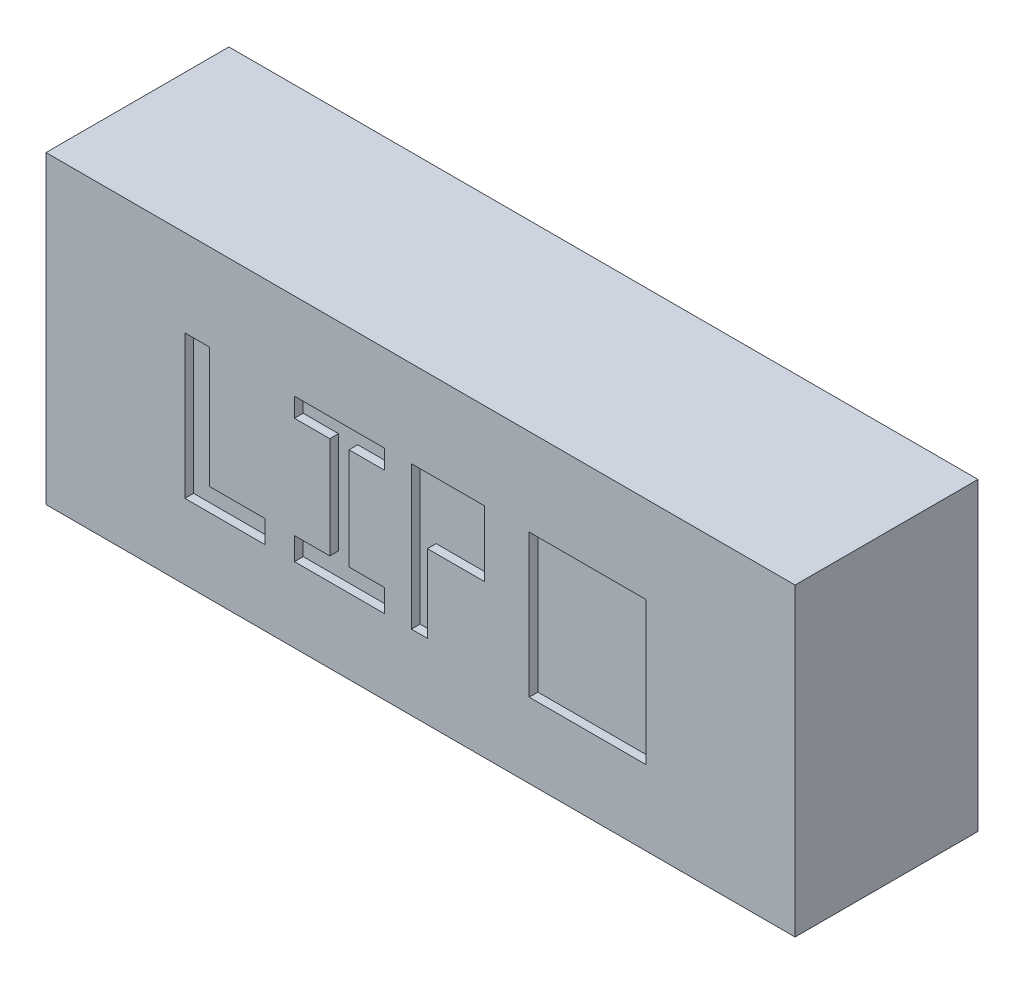
ISO-10303-21;
HEADER;
FILE_DESCRIPTION(('STEP AP214'),'2;1');
FILE_NAME('part.step','',(''),(''),'','','');
FILE_SCHEMA(('AUTOMOTIVE_DESIGN { 1 0 10303 214 1 1 1 1 }'));
ENDSEC;
DATA;
#1=APPLICATION_CONTEXT('core data for automotive mechanical design processes');
#2=APPLICATION_PROTOCOL_DEFINITION('international standard','automotive_design',2000,#1);
#3=PRODUCT_CONTEXT('',#1,'mechanical');
#4=PRODUCT('Part','Part','',(#3));
#5=PRODUCT_RELATED_PRODUCT_CATEGORY('part','',(#4));
#6=PRODUCT_DEFINITION_FORMATION('','',#4);
#7=PRODUCT_DEFINITION_CONTEXT('part definition',#1,'design');
#8=PRODUCT_DEFINITION('design','',#6,#7);
#9=PRODUCT_DEFINITION_SHAPE('','',#8);
#10=(LENGTH_UNIT() NAMED_UNIT(*) SI_UNIT(.MILLI.,.METRE.));
#11=(NAMED_UNIT(*) PLANE_ANGLE_UNIT() SI_UNIT($,.RADIAN.));
#12=(NAMED_UNIT(*) SI_UNIT($,.STERADIAN.) SOLID_ANGLE_UNIT());
#13=UNCERTAINTY_MEASURE_WITH_UNIT(LENGTH_MEASURE(1.E-05),#10,'distance_accuracy_value','');
#14=(GEOMETRIC_REPRESENTATION_CONTEXT(3) GLOBAL_UNCERTAINTY_ASSIGNED_CONTEXT((#13)) GLOBAL_UNIT_ASSIGNED_CONTEXT((#10,
#11,#12)) REPRESENTATION_CONTEXT('',''));
#15=CARTESIAN_POINT('',(0.,0.,0.));
#16=DIRECTION('',(0.,0.,1.));
#17=DIRECTION('',(1.,0.,0.));
#18=AXIS2_PLACEMENT_3D('',#15,#16,#17);
#19=CARTESIAN_POINT('',(43.,35.,10.5));
#20=DIRECTION('',(-1.,0.,0.));
#21=DIRECTION('',(0.,0.,1.));
#22=AXIS2_PLACEMENT_3D('',#19,#20,#21);
#23=PLANE('',#22);
#24=DIRECTION('',(0.,0.,-1.));
#25=VECTOR('',#24,1.);
#26=CARTESIAN_POINT('',(43.,0.,10.5));
#27=LINE('',#26,#25);
#28=CARTESIAN_POINT('',(43.,0.,10.5));
#29=VERTEX_POINT('',#28);
#30=CARTESIAN_POINT('',(43.,0.,-10.5));
#31=VERTEX_POINT('',#30);
#32=EDGE_CURVE('E313',#29,#31,#27,.T.);
#33=ORIENTED_EDGE('',*,*,#32,.T.);
#34=DIRECTION('',(0.,-1.,0.));
#35=VECTOR('',#34,1.);
#36=CARTESIAN_POINT('',(43.,35.,-10.5));
#37=LINE('',#36,#35);
#38=CARTESIAN_POINT('',(43.,35.,-10.5));
#39=VERTEX_POINT('',#38);
#40=EDGE_CURVE('E11',#39,#31,#37,.T.);
#41=ORIENTED_EDGE('',*,*,#40,.F.);
#42=DIRECTION('',(0.,0.,-1.));
#43=VECTOR('',#42,1.);
#44=CARTESIAN_POINT('',(43.,35.,10.5));
#45=LINE('',#44,#43);
#46=CARTESIAN_POINT('',(43.,35.,10.5));
#47=VERTEX_POINT('',#46);
#48=EDGE_CURVE('E565',#47,#39,#45,.T.);
#49=ORIENTED_EDGE('',*,*,#48,.F.);
#50=DIRECTION('',(0.,-1.,0.));
#51=VECTOR('',#50,1.);
#52=CARTESIAN_POINT('',(43.,35.,10.5));
#53=LINE('',#52,#51);
#54=EDGE_CURVE('E579',#47,#29,#53,.T.);
#55=ORIENTED_EDGE('',*,*,#54,.T.);
#56=EDGE_LOOP('',(#33,#41,#49,#55));
#57=FACE_BOUND('',#56,.T.);
#58=ADVANCED_FACE('F43',(#57),#23,.F.);
#59=CARTESIAN_POINT('',(-43.,35.,-10.5));
#60=DIRECTION('',(0.,0.,1.));
#61=DIRECTION('',(1.,0.,0.));
#62=AXIS2_PLACEMENT_3D('',#59,#60,#61);
#63=PLANE('',#62);
#64=DIRECTION('',(-1.,0.,0.));
#65=VECTOR('',#64,1.);
#66=CARTESIAN_POINT('',(-43.,0.,-10.5));
#67=LINE('',#66,#65);
#68=CARTESIAN_POINT('',(-43.,0.,-10.5));
#69=VERTEX_POINT('',#68);
#70=EDGE_CURVE('E583',#31,#69,#67,.T.);
#71=ORIENTED_EDGE('',*,*,#70,.T.);
#72=DIRECTION('',(0.,-1.,0.));
#73=VECTOR('',#72,1.);
#74=CARTESIAN_POINT('',(-43.,35.,-10.5));
#75=LINE('',#74,#73);
#76=CARTESIAN_POINT('',(-43.,35.,-10.5));
#77=VERTEX_POINT('',#76);
#78=EDGE_CURVE('E51',#77,#69,#75,.T.);
#79=ORIENTED_EDGE('',*,*,#78,.F.);
#80=DIRECTION('',(-1.,0.,0.));
#81=VECTOR('',#80,1.);
#82=CARTESIAN_POINT('',(-43.,35.,-10.5));
#83=LINE('',#82,#81);
#84=EDGE_CURVE('E569',#39,#77,#83,.T.);
#85=ORIENTED_EDGE('',*,*,#84,.F.);
#86=ORIENTED_EDGE('',*,*,#40,.T.);
#87=EDGE_LOOP('',(#71,#79,#85,#86));
#88=FACE_BOUND('',#87,.T.);
#89=ADVANCED_FACE('F619',(#88),#63,.F.);
#90=CARTESIAN_POINT('',(-43.,35.,10.5));
#91=DIRECTION('',(1.,0.,0.));
#92=DIRECTION('',(0.,0.,-1.));
#93=AXIS2_PLACEMENT_3D('',#90,#91,#92);
#94=PLANE('',#93);
#95=DIRECTION('',(0.,0.,1.));
#96=VECTOR('',#95,1.);
#97=CARTESIAN_POINT('',(-43.,0.,10.5));
#98=LINE('',#97,#96);
#99=CARTESIAN_POINT('',(-43.,0.,10.5));
#100=VERTEX_POINT('',#99);
#101=EDGE_CURVE('E586',#69,#100,#98,.T.);
#102=ORIENTED_EDGE('',*,*,#101,.T.);
#103=DIRECTION('',(0.,-1.,0.));
#104=VECTOR('',#103,1.);
#105=CARTESIAN_POINT('',(-43.,35.,10.5));
#106=LINE('',#105,#104);
#107=CARTESIAN_POINT('',(-43.,35.,10.5));
#108=VERTEX_POINT('',#107);
#109=EDGE_CURVE('E594',#108,#100,#106,.T.);
#110=ORIENTED_EDGE('',*,*,#109,.F.);
#111=DIRECTION('',(0.,0.,1.));
#112=VECTOR('',#111,1.);
#113=CARTESIAN_POINT('',(-43.,35.,10.5));
#114=LINE('',#113,#112);
#115=EDGE_CURVE('E573',#77,#108,#114,.T.);
#116=ORIENTED_EDGE('',*,*,#115,.F.);
#117=ORIENTED_EDGE('',*,*,#78,.T.);
#118=EDGE_LOOP('',(#102,#110,#116,#117));
#119=FACE_BOUND('',#118,.T.);
#120=ADVANCED_FACE('F603',(#119),#94,.F.);
#121=CARTESIAN_POINT('',(-43.,35.,10.5));
#122=DIRECTION('',(0.,0.,-1.));
#123=DIRECTION('',(-1.,0.,0.));
#124=AXIS2_PLACEMENT_3D('',#121,#122,#123);
#125=PLANE('',#124);
#126=DIRECTION('',(0.,-1.,0.));
#127=VECTOR('',#126,1.);
#128=CARTESIAN_POINT('',(-27.0629226582763,25.0435115271087,10.5));
#129=LINE('',#128,#127);
#130=CARTESIAN_POINT('',(-27.0629226582763,25.0435115271087,10.5));
#131=VERTEX_POINT('',#130);
#132=CARTESIAN_POINT('',(-27.0629226582763,8.5890830393935,10.5));
#133=VERTEX_POINT('',#132);
#134=EDGE_CURVE('E296',#131,#133,#129,.T.);
#135=ORIENTED_EDGE('',*,*,#134,.F.);
#136=DIRECTION('',(-1.,0.,0.));
#137=VECTOR('',#136,1.);
#138=CARTESIAN_POINT('',(-24.2468963063519,25.0435115271087,10.5));
#139=LINE('',#138,#137);
#140=CARTESIAN_POINT('',(-24.2468963063519,25.0435115271087,10.5));
#141=VERTEX_POINT('',#140);
#142=EDGE_CURVE('E58',#141,#131,#139,.T.);
#143=ORIENTED_EDGE('',*,*,#142,.F.);
#144=DIRECTION('',(0.,1.,0.));
#145=VECTOR('',#144,1.);
#146=CARTESIAN_POINT('',(-24.2468963063519,11.1842445794023,10.5));
#147=LINE('',#146,#145);
#148=CARTESIAN_POINT('',(-24.2468963063519,11.1842445794023,10.5));
#149=VERTEX_POINT('',#148);
#150=EDGE_CURVE('E276',#149,#141,#147,.T.);
#151=ORIENTED_EDGE('',*,*,#150,.F.);
#152=DIRECTION('',(-1.,0.,0.));
#153=VECTOR('',#152,1.);
#154=CARTESIAN_POINT('',(-17.8418167607983,11.1842445794023,10.5));
#155=LINE('',#154,#153);
#156=CARTESIAN_POINT('',(-17.8418167607983,11.1842445794023,10.5));
#157=VERTEX_POINT('',#156);
#158=EDGE_CURVE('E280',#157,#149,#155,.T.);
#159=ORIENTED_EDGE('',*,*,#158,.F.);
#160=DIRECTION('',(0.,1.,0.));
#161=VECTOR('',#160,1.);
#162=CARTESIAN_POINT('',(-17.8418167607983,8.5890830393935,10.5));
#163=LINE('',#162,#161);
#164=CARTESIAN_POINT('',(-17.8418167607983,8.5890830393935,10.5));
#165=VERTEX_POINT('',#164);
#166=EDGE_CURVE('E303',#165,#157,#163,.T.);
#167=ORIENTED_EDGE('',*,*,#166,.F.);
#168=DIRECTION('',(1.,0.,0.));
#169=VECTOR('',#168,1.);
#170=CARTESIAN_POINT('',(-27.0629226582763,8.5890830393935,10.5));
#171=LINE('',#170,#169);
#172=EDGE_CURVE('E299',#133,#165,#171,.T.);
#173=ORIENTED_EDGE('',*,*,#172,.F.);
#174=EDGE_LOOP('',(#135,#143,#151,#159,#167,#173));
#175=FACE_BOUND('',#174,.T.);
#176=DIRECTION('',(1.,0.,0.));
#177=VECTOR('',#176,1.);
#178=CARTESIAN_POINT('',(-14.4720643689634,22.8427684687815,10.5));
#179=LINE('',#178,#177);
#180=CARTESIAN_POINT('',(-14.4720643689634,22.8427684687815,10.5));
#181=VERTEX_POINT('',#180);
#182=CARTESIAN_POINT('',(-10.4195541005856,22.8427684687815,10.5));
#183=VERTEX_POINT('',#182);
#184=EDGE_CURVE('E404',#181,#183,#179,.T.);
#185=ORIENTED_EDGE('',*,*,#184,.F.);
#186=DIRECTION('',(0.,-1.,0.));
#187=VECTOR('',#186,1.);
#188=CARTESIAN_POINT('',(-14.4720643689634,25.0435115271087,10.5));
#189=LINE('',#188,#187);
#190=CARTESIAN_POINT('',(-14.4720643689634,25.0435115271087,10.5));
#191=VERTEX_POINT('',#190);
#192=EDGE_CURVE('E66',#191,#181,#189,.T.);
#193=ORIENTED_EDGE('',*,*,#192,.F.);
#194=DIRECTION('',(-1.,0.,0.));
#195=VECTOR('',#194,1.);
#196=CARTESIAN_POINT('',(-14.4720643689634,25.0435115271087,10.5));
#197=LINE('',#196,#195);
#198=CARTESIAN_POINT('',(-4.15526769299133,25.0435115271087,10.5));
#199=VERTEX_POINT('',#198);
#200=EDGE_CURVE('E363',#199,#191,#197,.T.);
#201=ORIENTED_EDGE('',*,*,#200,.F.);
#202=DIRECTION('',(0.,1.,0.));
#203=VECTOR('',#202,1.);
#204=CARTESIAN_POINT('',(-4.15526769299133,25.0435115271087,10.5));
#205=LINE('',#204,#203);
#206=CARTESIAN_POINT('',(-4.15526769299133,22.8427684687815,10.5));
#207=VERTEX_POINT('',#206);
#208=EDGE_CURVE('E367',#207,#199,#205,.T.);
#209=ORIENTED_EDGE('',*,*,#208,.F.);
#210=DIRECTION('',(1.,0.,0.));
#211=VECTOR('',#210,1.);
#212=CARTESIAN_POINT('',(-8.20777796136911,22.8427684687815,10.5));
#213=LINE('',#212,#211);
#214=CARTESIAN_POINT('',(-8.20777796136911,22.8427684687815,10.5));
#215=VERTEX_POINT('',#214);
#216=EDGE_CURVE('E372',#215,#207,#213,.T.);
#217=ORIENTED_EDGE('',*,*,#216,.F.);
#218=DIRECTION('',(0.,1.,0.));
#219=VECTOR('',#218,1.);
#220=CARTESIAN_POINT('',(-8.20777796136911,11.1842445794023,10.5));
#221=LINE('',#220,#219);
#222=CARTESIAN_POINT('',(-8.20777796136911,11.1842445794023,10.5));
#223=VERTEX_POINT('',#222);
#224=EDGE_CURVE('E376',#223,#215,#221,.T.);
#225=ORIENTED_EDGE('',*,*,#224,.F.);
#226=DIRECTION('',(-1.,0.,0.));
#227=VECTOR('',#226,1.);
#228=CARTESIAN_POINT('',(-4.15526769299133,11.1842445794023,10.5));
#229=LINE('',#228,#227);
#230=CARTESIAN_POINT('',(-4.15526769299133,11.1842445794023,10.5));
#231=VERTEX_POINT('',#230);
#232=EDGE_CURVE('E380',#231,#223,#229,.T.);
#233=ORIENTED_EDGE('',*,*,#232,.F.);
#234=DIRECTION('',(0.,1.,0.));
#235=VECTOR('',#234,1.);
#236=CARTESIAN_POINT('',(-4.15526769299133,8.5890830393935,10.5));
#237=LINE('',#236,#235);
#238=CARTESIAN_POINT('',(-4.15526769299133,8.5890830393935,10.5));
#239=VERTEX_POINT('',#238);
#240=EDGE_CURVE('E384',#239,#231,#237,.T.);
#241=ORIENTED_EDGE('',*,*,#240,.F.);
#242=DIRECTION('',(1.,0.,0.));
#243=VECTOR('',#242,1.);
#244=CARTESIAN_POINT('',(-14.4720643689634,8.5890830393935,10.5));
#245=LINE('',#244,#243);
#246=CARTESIAN_POINT('',(-14.4720643689634,8.5890830393935,10.5));
#247=VERTEX_POINT('',#246);
#248=EDGE_CURVE('E388',#247,#239,#245,.T.);
#249=ORIENTED_EDGE('',*,*,#248,.F.);
#250=DIRECTION('',(0.,-1.,0.));
#251=VECTOR('',#250,1.);
#252=CARTESIAN_POINT('',(-14.4720643689634,11.1842445794023,10.5));
#253=LINE('',#252,#251);
#254=CARTESIAN_POINT('',(-14.4720643689634,11.1842445794023,10.5));
#255=VERTEX_POINT('',#254);
#256=EDGE_CURVE('E392',#255,#247,#253,.T.);
#257=ORIENTED_EDGE('',*,*,#256,.F.);
#258=DIRECTION('',(-1.,0.,0.));
#259=VECTOR('',#258,1.);
#260=CARTESIAN_POINT('',(-10.4195541005856,11.1842445794023,10.5));
#261=LINE('',#260,#259);
#262=CARTESIAN_POINT('',(-10.4195541005856,11.1842445794023,10.5));
#263=VERTEX_POINT('',#262);
#264=EDGE_CURVE('E396',#263,#255,#261,.T.);
#265=ORIENTED_EDGE('',*,*,#264,.F.);
#266=DIRECTION('',(0.,-1.,0.));
#267=VECTOR('',#266,1.);
#268=CARTESIAN_POINT('',(-10.4195541005856,22.8427684687815,10.5));
#269=LINE('',#268,#267);
#270=EDGE_CURVE('E400',#183,#263,#269,.T.);
#271=ORIENTED_EDGE('',*,*,#270,.F.);
#272=EDGE_LOOP('',(#185,#193,#201,#209,#217,#225,#233,#241,#249,#257,#265,#271));
#273=FACE_BOUND('',#272,.T.);
#274=DIRECTION('',(0.,-1.,0.));
#275=VECTOR('',#274,1.);
#276=CARTESIAN_POINT('',(-1.05763576052508,25.0435115271087,10.5));
#277=LINE('',#276,#275);
#278=CARTESIAN_POINT('',(-1.05763576052508,25.0435115271087,10.5));
#279=VERTEX_POINT('',#278);
#280=CARTESIAN_POINT('',(-1.05763576052508,8.5890830393935,10.5));
#281=VERTEX_POINT('',#280);
#282=EDGE_CURVE('E494',#279,#281,#277,.T.);
#283=ORIENTED_EDGE('',*,*,#282,.F.);
#284=DIRECTION('',(-1.,0.,0.));
#285=VECTOR('',#284,1.);
#286=CARTESIAN_POINT('',(7.331069367304,25.0435115271087,10.5));
#287=LINE('',#286,#285);
#288=CARTESIAN_POINT('',(7.331069367304,25.0435115271087,10.5));
#289=VERTEX_POINT('',#288);
#290=EDGE_CURVE('E362',#289,#279,#287,.T.);
#291=ORIENTED_EDGE('',*,*,#290,.F.);
#292=DIRECTION('',(0.,1.,0.));
#293=VECTOR('',#292,1.);
#294=CARTESIAN_POINT('',(7.331069367304,17.5143122656707,10.5));
#295=LINE('',#294,#293);
#296=CARTESIAN_POINT('',(7.331069367304,17.5143122656707,10.5));
#297=VERTEX_POINT('',#296);
#298=EDGE_CURVE('E477',#297,#289,#295,.T.);
#299=ORIENTED_EDGE('',*,*,#298,.F.);
#300=DIRECTION('',(1.,0.,0.));
#301=VECTOR('',#300,1.);
#302=CARTESIAN_POINT('',(0.791487412813589,17.5143122656707,10.5));
#303=LINE('',#302,#301);
#304=CARTESIAN_POINT('',(0.791487412813589,17.5143122656707,10.5));
#305=VERTEX_POINT('',#304);
#306=EDGE_CURVE('E481',#305,#297,#303,.T.);
#307=ORIENTED_EDGE('',*,*,#306,.F.);
#308=DIRECTION('',(0.,1.,0.));
#309=VECTOR('',#308,1.);
#310=CARTESIAN_POINT('',(0.791487412813589,8.5890830393935,10.5));
#311=LINE('',#310,#309);
#312=CARTESIAN_POINT('',(0.791487412813589,8.5890830393935,10.5));
#313=VERTEX_POINT('',#312);
#314=EDGE_CURVE('E486',#313,#305,#311,.T.);
#315=ORIENTED_EDGE('',*,*,#314,.F.);
#316=DIRECTION('',(1.,0.,0.));
#317=VECTOR('',#316,1.);
#318=CARTESIAN_POINT('',(-1.05763576052508,8.5890830393935,10.5));
#319=LINE('',#318,#317);
#320=EDGE_CURVE('E490',#281,#313,#319,.T.);
#321=ORIENTED_EDGE('',*,*,#320,.F.);
#322=EDGE_LOOP('',(#283,#291,#299,#307,#315,#321));
#323=FACE_BOUND('',#322,.T.);
#324=DIRECTION('',(0.,-1.,0.));
#325=VECTOR('',#324,1.);
#326=CARTESIAN_POINT('',(12.4725338004896,25.0010060894322,10.5));
#327=LINE('',#326,#325);
#328=CARTESIAN_POINT('',(12.4725338004896,25.0010060894322,10.5));
#329=VERTEX_POINT('',#328);
#330=CARTESIAN_POINT('',(12.4725338004896,8.5890830393935,10.5));
#331=VERTEX_POINT('',#330);
#332=EDGE_CURVE('E545',#329,#331,#327,.T.);
#333=ORIENTED_EDGE('',*,*,#332,.F.);
#334=DIRECTION('',(-1.,0.,0.));
#335=VECTOR('',#334,1.);
#336=CARTESIAN_POINT('',(25.8674016658941,25.0010060894322,10.5));
#337=LINE('',#336,#335);
#338=CARTESIAN_POINT('',(25.8674016658941,25.0010060894322,10.5));
#339=VERTEX_POINT('',#338);
#340=EDGE_CURVE('E476',#339,#329,#337,.T.);
#341=ORIENTED_EDGE('',*,*,#340,.F.);
#342=DIRECTION('',(0.,1.,0.));
#343=VECTOR('',#342,1.);
#344=CARTESIAN_POINT('',(25.8674016658941,8.5890830393935,10.5));
#345=LINE('',#344,#343);
#346=CARTESIAN_POINT('',(25.8674016658941,8.5890830393935,10.5));
#347=VERTEX_POINT('',#346);
#348=EDGE_CURVE('E536',#347,#339,#345,.T.);
#349=ORIENTED_EDGE('',*,*,#348,.F.);
#350=DIRECTION('',(1.,0.,0.));
#351=VECTOR('',#350,1.);
#352=CARTESIAN_POINT('',(12.4725338004896,8.5890830393935,10.5));
#353=LINE('',#352,#351);
#354=EDGE_CURVE('E540',#331,#347,#353,.T.);
#355=ORIENTED_EDGE('',*,*,#354,.F.);
#356=EDGE_LOOP('',(#333,#341,#349,#355));
#357=FACE_BOUND('',#356,.T.);
#358=DIRECTION('',(1.,0.,0.));
#359=VECTOR('',#358,1.);
#360=CARTESIAN_POINT('',(-43.,0.,10.5));
#361=LINE('',#360,#359);
#362=EDGE_CURVE('E570',#100,#29,#361,.T.);
#363=ORIENTED_EDGE('',*,*,#362,.T.);
#364=ORIENTED_EDGE('',*,*,#54,.F.);
#365=DIRECTION('',(1.,0.,0.));
#366=VECTOR('',#365,1.);
#367=CARTESIAN_POINT('',(-43.,35.,10.5));
#368=LINE('',#367,#366);
#369=EDGE_CURVE('E576',#108,#47,#368,.T.);
#370=ORIENTED_EDGE('',*,*,#369,.F.);
#371=ORIENTED_EDGE('',*,*,#109,.T.);
#372=EDGE_LOOP('',(#363,#364,#370,#371));
#373=FACE_BOUND('',#372,.T.);
#374=ADVANCED_FACE('F612',(#175,#273,#323,#357,#373),#125,.F.);
#375=CARTESIAN_POINT('',(0.,35.,0.));
#376=DIRECTION('',(0.,-1.,0.));
#377=DIRECTION('',(0.,0.,-1.));
#378=AXIS2_PLACEMENT_3D('',#375,#376,#377);
#379=PLANE('',#378);
#380=ORIENTED_EDGE('',*,*,#48,.T.);
#381=ORIENTED_EDGE('',*,*,#84,.T.);
#382=ORIENTED_EDGE('',*,*,#115,.T.);
#383=ORIENTED_EDGE('',*,*,#369,.T.);
#384=EDGE_LOOP('',(#380,#381,#382,#383));
#385=FACE_BOUND('',#384,.T.);
#386=ADVANCED_FACE('F618',(#385),#379,.F.);
#387=CARTESIAN_POINT('',(0.,0.,0.));
#388=DIRECTION('',(0.,-1.,0.));
#389=DIRECTION('',(0.,0.,-1.));
#390=AXIS2_PLACEMENT_3D('',#387,#388,#389);
#391=PLANE('',#390);
#392=ORIENTED_EDGE('',*,*,#32,.F.);
#393=ORIENTED_EDGE('',*,*,#362,.F.);
#394=ORIENTED_EDGE('',*,*,#101,.F.);
#395=ORIENTED_EDGE('',*,*,#70,.F.);
#396=EDGE_LOOP('',(#392,#393,#394,#395));
#397=FACE_BOUND('',#396,.T.);
#398=ADVANCED_FACE('F609',(#397),#391,.T.);
#399=CARTESIAN_POINT('',(25.8674016658941,25.0010060894322,9.5));
#400=DIRECTION('',(0.,1.,0.));
#401=DIRECTION('',(0.,0.,1.));
#402=AXIS2_PLACEMENT_3D('',#399,#400,#401);
#403=PLANE('',#402);
#404=ORIENTED_EDGE('',*,*,#340,.T.);
#405=DIRECTION('',(0.,0.,1.));
#406=VECTOR('',#405,1.);
#407=CARTESIAN_POINT('',(12.4725338004896,25.0010060894322,9.5));
#408=LINE('',#407,#406);
#409=CARTESIAN_POINT('',(12.4725338004896,25.0010060894322,9.5));
#410=VERTEX_POINT('',#409);
#411=EDGE_CURVE('E522',#410,#329,#408,.T.);
#412=ORIENTED_EDGE('',*,*,#411,.F.);
#413=DIRECTION('',(-1.,0.,0.));
#414=VECTOR('',#413,1.);
#415=CARTESIAN_POINT('',(25.8674016658941,25.0010060894322,9.5));
#416=LINE('',#415,#414);
#417=CARTESIAN_POINT('',(25.8674016658941,25.0010060894322,9.5));
#418=VERTEX_POINT('',#417);
#419=EDGE_CURVE('E541',#418,#410,#416,.T.);
#420=ORIENTED_EDGE('',*,*,#419,.F.);
#421=DIRECTION('',(0.,0.,1.));
#422=VECTOR('',#421,1.);
#423=CARTESIAN_POINT('',(25.8674016658941,25.0010060894322,9.5));
#424=LINE('',#423,#422);
#425=EDGE_CURVE('E533',#418,#339,#424,.T.);
#426=ORIENTED_EDGE('',*,*,#425,.T.);
#427=EDGE_LOOP('',(#404,#412,#420,#426));
#428=FACE_BOUND('',#427,.T.);
#429=ADVANCED_FACE('F632',(#428),#403,.F.);
#430=CARTESIAN_POINT('',(25.8674016658941,8.5890830393935,9.5));
#431=DIRECTION('',(1.,0.,0.));
#432=DIRECTION('',(0.,0.,-1.));
#433=AXIS2_PLACEMENT_3D('',#430,#431,#432);
#434=PLANE('',#433);
#435=ORIENTED_EDGE('',*,*,#348,.T.);
#436=ORIENTED_EDGE('',*,*,#425,.F.);
#437=DIRECTION('',(0.,1.,0.));
#438=VECTOR('',#437,1.);
#439=CARTESIAN_POINT('',(25.8674016658941,8.5890830393935,9.5));
#440=LINE('',#439,#438);
#441=CARTESIAN_POINT('',(25.8674016658941,8.5890830393935,9.5));
#442=VERTEX_POINT('',#441);
#443=EDGE_CURVE('E526',#442,#418,#440,.T.);
#444=ORIENTED_EDGE('',*,*,#443,.F.);
#445=DIRECTION('',(0.,0.,1.));
#446=VECTOR('',#445,1.);
#447=CARTESIAN_POINT('',(25.8674016658941,8.5890830393935,9.5));
#448=LINE('',#447,#446);
#449=EDGE_CURVE('E530',#442,#347,#448,.T.);
#450=ORIENTED_EDGE('',*,*,#449,.T.);
#451=EDGE_LOOP('',(#435,#436,#444,#450));
#452=FACE_BOUND('',#451,.T.);
#453=ADVANCED_FACE('F641',(#452),#434,.F.);
#454=CARTESIAN_POINT('',(12.4725338004896,8.5890830393935,9.5));
#455=DIRECTION('',(0.,-1.,0.));
#456=DIRECTION('',(0.,0.,-1.));
#457=AXIS2_PLACEMENT_3D('',#454,#455,#456);
#458=PLANE('',#457);
#459=ORIENTED_EDGE('',*,*,#354,.T.);
#460=ORIENTED_EDGE('',*,*,#449,.F.);
#461=DIRECTION('',(1.,0.,0.));
#462=VECTOR('',#461,1.);
#463=CARTESIAN_POINT('',(12.4725338004896,8.5890830393935,9.5));
#464=LINE('',#463,#462);
#465=CARTESIAN_POINT('',(12.4725338004896,8.5890830393935,9.5));
#466=VERTEX_POINT('',#465);
#467=EDGE_CURVE('E554',#466,#442,#464,.T.);
#468=ORIENTED_EDGE('',*,*,#467,.F.);
#469=DIRECTION('',(0.,0.,1.));
#470=VECTOR('',#469,1.);
#471=CARTESIAN_POINT('',(12.4725338004896,8.5890830393935,9.5));
#472=LINE('',#471,#470);
#473=EDGE_CURVE('E527',#466,#331,#472,.T.);
#474=ORIENTED_EDGE('',*,*,#473,.T.);
#475=EDGE_LOOP('',(#459,#460,#468,#474));
#476=FACE_BOUND('',#475,.T.);
#477=ADVANCED_FACE('F644',(#476),#458,.F.);
#478=CARTESIAN_POINT('',(12.4725338004896,25.0010060894322,9.5));
#479=DIRECTION('',(-1.,0.,0.));
#480=DIRECTION('',(0.,0.,1.));
#481=AXIS2_PLACEMENT_3D('',#478,#479,#480);
#482=PLANE('',#481);
#483=ORIENTED_EDGE('',*,*,#332,.T.);
#484=ORIENTED_EDGE('',*,*,#473,.F.);
#485=DIRECTION('',(0.,-1.,0.));
#486=VECTOR('',#485,1.);
#487=CARTESIAN_POINT('',(12.4725338004896,25.0010060894322,9.5));
#488=LINE('',#487,#486);
#489=EDGE_CURVE('E558',#410,#466,#488,.T.);
#490=ORIENTED_EDGE('',*,*,#489,.F.);
#491=ORIENTED_EDGE('',*,*,#411,.T.);
#492=EDGE_LOOP('',(#483,#484,#490,#491));
#493=FACE_BOUND('',#492,.T.);
#494=ADVANCED_FACE('F639',(#493),#482,.F.);
#495=CARTESIAN_POINT('',(0.,0.,9.5));
#496=DIRECTION('',(0.,0.,1.));
#497=DIRECTION('',(1.,0.,0.));
#498=AXIS2_PLACEMENT_3D('',#495,#496,#497);
#499=PLANE('',#498);
#500=ORIENTED_EDGE('',*,*,#419,.T.);
#501=ORIENTED_EDGE('',*,*,#489,.T.);
#502=ORIENTED_EDGE('',*,*,#467,.T.);
#503=ORIENTED_EDGE('',*,*,#443,.T.);
#504=EDGE_LOOP('',(#500,#501,#502,#503));
#505=FACE_BOUND('',#504,.T.);
#506=ADVANCED_FACE('F635',(#505),#499,.T.);
#507=CARTESIAN_POINT('',(7.331069367304,25.0435115271087,9.5));
#508=DIRECTION('',(0.,1.,0.));
#509=DIRECTION('',(0.,0.,1.));
#510=AXIS2_PLACEMENT_3D('',#507,#508,#509);
#511=PLANE('',#510);
#512=ORIENTED_EDGE('',*,*,#290,.T.);
#513=DIRECTION('',(0.,0.,1.));
#514=VECTOR('',#513,1.);
#515=CARTESIAN_POINT('',(-1.05763576052508,25.0435115271087,9.5));
#516=LINE('',#515,#514);
#517=CARTESIAN_POINT('',(-1.05763576052508,25.0435115271087,9.5));
#518=VERTEX_POINT('',#517);
#519=EDGE_CURVE('E456',#518,#279,#516,.T.);
#520=ORIENTED_EDGE('',*,*,#519,.F.);
#521=DIRECTION('',(-1.,0.,0.));
#522=VECTOR('',#521,1.);
#523=CARTESIAN_POINT('',(7.331069367304,25.0435115271087,9.5));
#524=LINE('',#523,#522);
#525=CARTESIAN_POINT('',(7.331069367304,25.0435115271087,9.5));
#526=VERTEX_POINT('',#525);
#527=EDGE_CURVE('E482',#526,#518,#524,.T.);
#528=ORIENTED_EDGE('',*,*,#527,.F.);
#529=DIRECTION('',(0.,0.,1.));
#530=VECTOR('',#529,1.);
#531=CARTESIAN_POINT('',(7.331069367304,25.0435115271087,9.5));
#532=LINE('',#531,#530);
#533=EDGE_CURVE('E473',#526,#289,#532,.T.);
#534=ORIENTED_EDGE('',*,*,#533,.T.);
#535=EDGE_LOOP('',(#512,#520,#528,#534));
#536=FACE_BOUND('',#535,.T.);
#537=ADVANCED_FACE('F638',(#536),#511,.F.);
#538=CARTESIAN_POINT('',(7.331069367304,17.5143122656707,9.5));
#539=DIRECTION('',(1.,0.,0.));
#540=DIRECTION('',(0.,0.,-1.));
#541=AXIS2_PLACEMENT_3D('',#538,#539,#540);
#542=PLANE('',#541);
#543=ORIENTED_EDGE('',*,*,#298,.T.);
#544=ORIENTED_EDGE('',*,*,#533,.F.);
#545=DIRECTION('',(0.,1.,0.));
#546=VECTOR('',#545,1.);
#547=CARTESIAN_POINT('',(7.331069367304,17.5143122656707,9.5));
#548=LINE('',#547,#546);
#549=CARTESIAN_POINT('',(7.331069367304,17.5143122656707,9.5));
#550=VERTEX_POINT('',#549);
#551=EDGE_CURVE('E460',#550,#526,#548,.T.);
#552=ORIENTED_EDGE('',*,*,#551,.F.);
#553=DIRECTION('',(0.,0.,1.));
#554=VECTOR('',#553,1.);
#555=CARTESIAN_POINT('',(7.331069367304,17.5143122656707,9.5));
#556=LINE('',#555,#554);
#557=EDGE_CURVE('E470',#550,#297,#556,.T.);
#558=ORIENTED_EDGE('',*,*,#557,.T.);
#559=EDGE_LOOP('',(#543,#544,#552,#558));
#560=FACE_BOUND('',#559,.T.);
#561=ADVANCED_FACE('F661',(#560),#542,.F.);
#562=CARTESIAN_POINT('',(0.791487412813589,17.5143122656707,9.5));
#563=DIRECTION('',(0.,-1.,0.));
#564=DIRECTION('',(0.,0.,-1.));
#565=AXIS2_PLACEMENT_3D('',#562,#563,#564);
#566=PLANE('',#565);
#567=ORIENTED_EDGE('',*,*,#306,.T.);
#568=ORIENTED_EDGE('',*,*,#557,.F.);
#569=DIRECTION('',(1.,0.,0.));
#570=VECTOR('',#569,1.);
#571=CARTESIAN_POINT('',(0.791487412813589,17.5143122656707,9.5));
#572=LINE('',#571,#570);
#573=CARTESIAN_POINT('',(0.791487412813589,17.5143122656707,9.5));
#574=VERTEX_POINT('',#573);
#575=EDGE_CURVE('E503',#574,#550,#572,.T.);
#576=ORIENTED_EDGE('',*,*,#575,.F.);
#577=DIRECTION('',(0.,0.,1.));
#578=VECTOR('',#577,1.);
#579=CARTESIAN_POINT('',(0.791487412813589,17.5143122656707,9.5));
#580=LINE('',#579,#578);
#581=EDGE_CURVE('E467',#574,#305,#580,.T.);
#582=ORIENTED_EDGE('',*,*,#581,.T.);
#583=EDGE_LOOP('',(#567,#568,#576,#582));
#584=FACE_BOUND('',#583,.T.);
#585=ADVANCED_FACE('F664',(#584),#566,.F.);
#586=CARTESIAN_POINT('',(0.791487412813589,8.5890830393935,9.5));
#587=DIRECTION('',(1.,0.,0.));
#588=DIRECTION('',(0.,0.,-1.));
#589=AXIS2_PLACEMENT_3D('',#586,#587,#588);
#590=PLANE('',#589);
#591=ORIENTED_EDGE('',*,*,#314,.T.);
#592=ORIENTED_EDGE('',*,*,#581,.F.);
#593=DIRECTION('',(0.,1.,0.));
#594=VECTOR('',#593,1.);
#595=CARTESIAN_POINT('',(0.791487412813589,8.5890830393935,9.5));
#596=LINE('',#595,#594);
#597=CARTESIAN_POINT('',(0.791487412813589,8.5890830393935,9.5));
#598=VERTEX_POINT('',#597);
#599=EDGE_CURVE('E507',#598,#574,#596,.T.);
#600=ORIENTED_EDGE('',*,*,#599,.F.);
#601=DIRECTION('',(0.,0.,1.));
#602=VECTOR('',#601,1.);
#603=CARTESIAN_POINT('',(0.791487412813589,8.5890830393935,9.5));
#604=LINE('',#603,#602);
#605=EDGE_CURVE('E464',#598,#313,#604,.T.);
#606=ORIENTED_EDGE('',*,*,#605,.T.);
#607=EDGE_LOOP('',(#591,#592,#600,#606));
#608=FACE_BOUND('',#607,.T.);
#609=ADVANCED_FACE('F668',(#608),#590,.F.);
#610=CARTESIAN_POINT('',(-1.05763576052508,8.5890830393935,9.5));
#611=DIRECTION('',(0.,-1.,0.));
#612=DIRECTION('',(0.,0.,-1.));
#613=AXIS2_PLACEMENT_3D('',#610,#611,#612);
#614=PLANE('',#613);
#615=ORIENTED_EDGE('',*,*,#320,.T.);
#616=ORIENTED_EDGE('',*,*,#605,.F.);
#617=DIRECTION('',(1.,0.,0.));
#618=VECTOR('',#617,1.);
#619=CARTESIAN_POINT('',(-1.05763576052508,8.5890830393935,9.5));
#620=LINE('',#619,#618);
#621=CARTESIAN_POINT('',(-1.05763576052508,8.5890830393935,9.5));
#622=VERTEX_POINT('',#621);
#623=EDGE_CURVE('E511',#622,#598,#620,.T.);
#624=ORIENTED_EDGE('',*,*,#623,.F.);
#625=DIRECTION('',(0.,0.,1.));
#626=VECTOR('',#625,1.);
#627=CARTESIAN_POINT('',(-1.05763576052508,8.5890830393935,9.5));
#628=LINE('',#627,#626);
#629=EDGE_CURVE('E461',#622,#281,#628,.T.);
#630=ORIENTED_EDGE('',*,*,#629,.T.);
#631=EDGE_LOOP('',(#615,#616,#624,#630));
#632=FACE_BOUND('',#631,.T.);
#633=ADVANCED_FACE('F672',(#632),#614,.F.);
#634=CARTESIAN_POINT('',(-1.05763576052508,25.0435115271087,9.5));
#635=DIRECTION('',(-1.,0.,0.));
#636=DIRECTION('',(0.,0.,1.));
#637=AXIS2_PLACEMENT_3D('',#634,#635,#636);
#638=PLANE('',#637);
#639=ORIENTED_EDGE('',*,*,#282,.T.);
#640=ORIENTED_EDGE('',*,*,#629,.F.);
#641=DIRECTION('',(0.,-1.,0.));
#642=VECTOR('',#641,1.);
#643=CARTESIAN_POINT('',(-1.05763576052508,25.0435115271087,9.5));
#644=LINE('',#643,#642);
#645=EDGE_CURVE('E515',#518,#622,#644,.T.);
#646=ORIENTED_EDGE('',*,*,#645,.F.);
#647=ORIENTED_EDGE('',*,*,#519,.T.);
#648=EDGE_LOOP('',(#639,#640,#646,#647));
#649=FACE_BOUND('',#648,.T.);
#650=ADVANCED_FACE('F659',(#649),#638,.F.);
#651=CARTESIAN_POINT('',(0.,0.,9.5));
#652=DIRECTION('',(0.,0.,1.));
#653=DIRECTION('',(1.,0.,0.));
#654=AXIS2_PLACEMENT_3D('',#651,#652,#653);
#655=PLANE('',#654);
#656=ORIENTED_EDGE('',*,*,#527,.T.);
#657=ORIENTED_EDGE('',*,*,#645,.T.);
#658=ORIENTED_EDGE('',*,*,#623,.T.);
#659=ORIENTED_EDGE('',*,*,#599,.T.);
#660=ORIENTED_EDGE('',*,*,#575,.T.);
#661=ORIENTED_EDGE('',*,*,#551,.T.);
#662=EDGE_LOOP('',(#656,#657,#658,#659,#660,#661));
#663=FACE_BOUND('',#662,.T.);
#664=ADVANCED_FACE('F655',(#663),#655,.T.);
#665=CARTESIAN_POINT('',(-14.4720643689634,25.0435115271087,9.5));
#666=DIRECTION('',(-1.,0.,0.));
#667=DIRECTION('',(0.,0.,1.));
#668=AXIS2_PLACEMENT_3D('',#665,#666,#667);
#669=PLANE('',#668);
#670=ORIENTED_EDGE('',*,*,#192,.T.);
#671=DIRECTION('',(0.,0.,1.));
#672=VECTOR('',#671,1.);
#673=CARTESIAN_POINT('',(-14.4720643689634,22.8427684687815,9.5));
#674=LINE('',#673,#672);
#675=CARTESIAN_POINT('',(-14.4720643689634,22.8427684687815,9.5));
#676=VERTEX_POINT('',#675);
#677=EDGE_CURVE('E325',#676,#181,#674,.T.);
#678=ORIENTED_EDGE('',*,*,#677,.F.);
#679=DIRECTION('',(0.,-1.,0.));
#680=VECTOR('',#679,1.);
#681=CARTESIAN_POINT('',(-14.4720643689634,25.0435115271087,9.5));
#682=LINE('',#681,#680);
#683=CARTESIAN_POINT('',(-14.4720643689634,25.0435115271087,9.5));
#684=VERTEX_POINT('',#683);
#685=EDGE_CURVE('E368',#684,#676,#682,.T.);
#686=ORIENTED_EDGE('',*,*,#685,.F.);
#687=DIRECTION('',(0.,0.,1.));
#688=VECTOR('',#687,1.);
#689=CARTESIAN_POINT('',(-14.4720643689634,25.0435115271087,9.5));
#690=LINE('',#689,#688);
#691=EDGE_CURVE('E359',#684,#191,#690,.T.);
#692=ORIENTED_EDGE('',*,*,#691,.T.);
#693=EDGE_LOOP('',(#670,#678,#686,#692));
#694=FACE_BOUND('',#693,.T.);
#695=ADVANCED_FACE('F658',(#694),#669,.F.);
#696=CARTESIAN_POINT('',(-14.4720643689634,25.0435115271087,9.5));
#697=DIRECTION('',(0.,1.,0.));
#698=DIRECTION('',(0.,0.,1.));
#699=AXIS2_PLACEMENT_3D('',#696,#697,#698);
#700=PLANE('',#699);
#701=ORIENTED_EDGE('',*,*,#200,.T.);
#702=ORIENTED_EDGE('',*,*,#691,.F.);
#703=DIRECTION('',(-1.,0.,0.));
#704=VECTOR('',#703,1.);
#705=CARTESIAN_POINT('',(-14.4720643689634,25.0435115271087,9.5));
#706=LINE('',#705,#704);
#707=CARTESIAN_POINT('',(-4.15526769299133,25.0435115271087,9.5));
#708=VERTEX_POINT('',#707);
#709=EDGE_CURVE('E328',#708,#684,#706,.T.);
#710=ORIENTED_EDGE('',*,*,#709,.F.);
#711=DIRECTION('',(0.,0.,1.));
#712=VECTOR('',#711,1.);
#713=CARTESIAN_POINT('',(-4.15526769299133,25.0435115271087,9.5));
#714=LINE('',#713,#712);
#715=EDGE_CURVE('E356',#708,#199,#714,.T.);
#716=ORIENTED_EDGE('',*,*,#715,.T.);
#717=EDGE_LOOP('',(#701,#702,#710,#716));
#718=FACE_BOUND('',#717,.T.);
#719=ADVANCED_FACE('F688',(#718),#700,.F.);
#720=CARTESIAN_POINT('',(-4.15526769299133,25.0435115271087,9.5));
#721=DIRECTION('',(1.,0.,0.));
#722=DIRECTION('',(0.,1.,0.));
#723=AXIS2_PLACEMENT_3D('',#720,#721,#722);
#724=PLANE('',#723);
#725=ORIENTED_EDGE('',*,*,#208,.T.);
#726=ORIENTED_EDGE('',*,*,#715,.F.);
#727=DIRECTION('',(0.,1.,0.));
#728=VECTOR('',#727,1.);
#729=CARTESIAN_POINT('',(-4.15526769299133,25.0435115271087,9.5));
#730=LINE('',#729,#728);
#731=CARTESIAN_POINT('',(-4.15526769299133,22.8427684687815,9.5));
#732=VERTEX_POINT('',#731);
#733=EDGE_CURVE('E413',#732,#708,#730,.T.);
#734=ORIENTED_EDGE('',*,*,#733,.F.);
#735=DIRECTION('',(0.,0.,1.));
#736=VECTOR('',#735,1.);
#737=CARTESIAN_POINT('',(-4.15526769299133,22.8427684687815,9.5));
#738=LINE('',#737,#736);
#739=EDGE_CURVE('E353',#732,#207,#738,.T.);
#740=ORIENTED_EDGE('',*,*,#739,.T.);
#741=EDGE_LOOP('',(#725,#726,#734,#740));
#742=FACE_BOUND('',#741,.T.);
#743=ADVANCED_FACE('F691',(#742),#724,.F.);
#744=CARTESIAN_POINT('',(-8.20777796136911,22.8427684687815,9.5));
#745=DIRECTION('',(0.,-1.,0.));
#746=DIRECTION('',(0.,0.,-1.));
#747=AXIS2_PLACEMENT_3D('',#744,#745,#746);
#748=PLANE('',#747);
#749=ORIENTED_EDGE('',*,*,#216,.T.);
#750=ORIENTED_EDGE('',*,*,#739,.F.);
#751=DIRECTION('',(1.,0.,0.));
#752=VECTOR('',#751,1.);
#753=CARTESIAN_POINT('',(-8.20777796136911,22.8427684687815,9.5));
#754=LINE('',#753,#752);
#755=CARTESIAN_POINT('',(-8.20777796136911,22.8427684687815,9.5));
#756=VERTEX_POINT('',#755);
#757=EDGE_CURVE('E417',#756,#732,#754,.T.);
#758=ORIENTED_EDGE('',*,*,#757,.F.);
#759=DIRECTION('',(0.,0.,1.));
#760=VECTOR('',#759,1.);
#761=CARTESIAN_POINT('',(-8.20777796136911,22.8427684687815,9.5));
#762=LINE('',#761,#760);
#763=EDGE_CURVE('E350',#756,#215,#762,.T.);
#764=ORIENTED_EDGE('',*,*,#763,.T.);
#765=EDGE_LOOP('',(#749,#750,#758,#764));
#766=FACE_BOUND('',#765,.T.);
#767=ADVANCED_FACE('F695',(#766),#748,.F.);
#768=CARTESIAN_POINT('',(-8.20777796136911,11.1842445794023,9.5));
#769=DIRECTION('',(1.,0.,0.));
#770=DIRECTION('',(0.,1.,0.));
#771=AXIS2_PLACEMENT_3D('',#768,#769,#770);
#772=PLANE('',#771);
#773=ORIENTED_EDGE('',*,*,#224,.T.);
#774=ORIENTED_EDGE('',*,*,#763,.F.);
#775=DIRECTION('',(0.,1.,0.));
#776=VECTOR('',#775,1.);
#777=CARTESIAN_POINT('',(-8.20777796136911,11.1842445794023,9.5));
#778=LINE('',#777,#776);
#779=CARTESIAN_POINT('',(-8.20777796136911,11.1842445794023,9.5));
#780=VERTEX_POINT('',#779);
#781=EDGE_CURVE('E421',#780,#756,#778,.T.);
#782=ORIENTED_EDGE('',*,*,#781,.F.);
#783=DIRECTION('',(0.,0.,1.));
#784=VECTOR('',#783,1.);
#785=CARTESIAN_POINT('',(-8.20777796136911,11.1842445794023,9.5));
#786=LINE('',#785,#784);
#787=EDGE_CURVE('E347',#780,#223,#786,.T.);
#788=ORIENTED_EDGE('',*,*,#787,.T.);
#789=EDGE_LOOP('',(#773,#774,#782,#788));
#790=FACE_BOUND('',#789,.T.);
#791=ADVANCED_FACE('F699',(#790),#772,.F.);
#792=CARTESIAN_POINT('',(-4.15526769299133,11.1842445794023,9.5));
#793=DIRECTION('',(0.,1.,0.));
#794=DIRECTION('',(-1.,0.,0.));
#795=AXIS2_PLACEMENT_3D('',#792,#793,#794);
#796=PLANE('',#795);
#797=ORIENTED_EDGE('',*,*,#232,.T.);
#798=ORIENTED_EDGE('',*,*,#787,.F.);
#799=DIRECTION('',(-1.,0.,0.));
#800=VECTOR('',#799,1.);
#801=CARTESIAN_POINT('',(-4.15526769299133,11.1842445794023,9.5));
#802=LINE('',#801,#800);
#803=CARTESIAN_POINT('',(-4.15526769299133,11.1842445794023,9.5));
#804=VERTEX_POINT('',#803);
#805=EDGE_CURVE('E425',#804,#780,#802,.T.);
#806=ORIENTED_EDGE('',*,*,#805,.F.);
#807=DIRECTION('',(0.,0.,1.));
#808=VECTOR('',#807,1.);
#809=CARTESIAN_POINT('',(-4.15526769299133,11.1842445794023,9.5));
#810=LINE('',#809,#808);
#811=EDGE_CURVE('E344',#804,#231,#810,.T.);
#812=ORIENTED_EDGE('',*,*,#811,.T.);
#813=EDGE_LOOP('',(#797,#798,#806,#812));
#814=FACE_BOUND('',#813,.T.);
#815=ADVANCED_FACE('F703',(#814),#796,.F.);
#816=CARTESIAN_POINT('',(-4.15526769299133,8.5890830393935,9.5));
#817=DIRECTION('',(1.,0.,0.));
#818=DIRECTION('',(0.,1.,0.));
#819=AXIS2_PLACEMENT_3D('',#816,#817,#818);
#820=PLANE('',#819);
#821=ORIENTED_EDGE('',*,*,#240,.T.);
#822=ORIENTED_EDGE('',*,*,#811,.F.);
#823=DIRECTION('',(0.,1.,0.));
#824=VECTOR('',#823,1.);
#825=CARTESIAN_POINT('',(-4.15526769299133,8.5890830393935,9.5));
#826=LINE('',#825,#824);
#827=CARTESIAN_POINT('',(-4.15526769299133,8.5890830393935,9.5));
#828=VERTEX_POINT('',#827);
#829=EDGE_CURVE('E429',#828,#804,#826,.T.);
#830=ORIENTED_EDGE('',*,*,#829,.F.);
#831=DIRECTION('',(0.,0.,1.));
#832=VECTOR('',#831,1.);
#833=CARTESIAN_POINT('',(-4.15526769299133,8.5890830393935,9.5));
#834=LINE('',#833,#832);
#835=EDGE_CURVE('E341',#828,#239,#834,.T.);
#836=ORIENTED_EDGE('',*,*,#835,.T.);
#837=EDGE_LOOP('',(#821,#822,#830,#836));
#838=FACE_BOUND('',#837,.T.);
#839=ADVANCED_FACE('F707',(#838),#820,.F.);
#840=CARTESIAN_POINT('',(-14.4720643689634,8.5890830393935,9.5));
#841=DIRECTION('',(0.,-1.,0.));
#842=DIRECTION('',(1.,0.,0.));
#843=AXIS2_PLACEMENT_3D('',#840,#841,#842);
#844=PLANE('',#843);
#845=ORIENTED_EDGE('',*,*,#248,.T.);
#846=ORIENTED_EDGE('',*,*,#835,.F.);
#847=DIRECTION('',(1.,0.,0.));
#848=VECTOR('',#847,1.);
#849=CARTESIAN_POINT('',(-14.4720643689634,8.5890830393935,9.5));
#850=LINE('',#849,#848);
#851=CARTESIAN_POINT('',(-14.4720643689634,8.5890830393935,9.5));
#852=VERTEX_POINT('',#851);
#853=EDGE_CURVE('E433',#852,#828,#850,.T.);
#854=ORIENTED_EDGE('',*,*,#853,.F.);
#855=DIRECTION('',(0.,0.,1.));
#856=VECTOR('',#855,1.);
#857=CARTESIAN_POINT('',(-14.4720643689634,8.5890830393935,9.5));
#858=LINE('',#857,#856);
#859=EDGE_CURVE('E338',#852,#247,#858,.T.);
#860=ORIENTED_EDGE('',*,*,#859,.T.);
#861=EDGE_LOOP('',(#845,#846,#854,#860));
#862=FACE_BOUND('',#861,.T.);
#863=ADVANCED_FACE('F711',(#862),#844,.F.);
#864=CARTESIAN_POINT('',(-14.4720643689634,11.1842445794023,9.5));
#865=DIRECTION('',(-1.,0.,0.));
#866=DIRECTION('',(0.,0.,1.));
#867=AXIS2_PLACEMENT_3D('',#864,#865,#866);
#868=PLANE('',#867);
#869=ORIENTED_EDGE('',*,*,#256,.T.);
#870=ORIENTED_EDGE('',*,*,#859,.F.);
#871=DIRECTION('',(0.,-1.,0.));
#872=VECTOR('',#871,1.);
#873=CARTESIAN_POINT('',(-14.4720643689634,11.1842445794023,9.5));
#874=LINE('',#873,#872);
#875=CARTESIAN_POINT('',(-14.4720643689634,11.1842445794023,9.5));
#876=VERTEX_POINT('',#875);
#877=EDGE_CURVE('E437',#876,#852,#874,.T.);
#878=ORIENTED_EDGE('',*,*,#877,.F.);
#879=DIRECTION('',(0.,0.,1.));
#880=VECTOR('',#879,1.);
#881=CARTESIAN_POINT('',(-14.4720643689634,11.1842445794023,9.5));
#882=LINE('',#881,#880);
#883=EDGE_CURVE('E335',#876,#255,#882,.T.);
#884=ORIENTED_EDGE('',*,*,#883,.T.);
#885=EDGE_LOOP('',(#869,#870,#878,#884));
#886=FACE_BOUND('',#885,.T.);
#887=ADVANCED_FACE('F715',(#886),#868,.F.);
#888=CARTESIAN_POINT('',(-10.4195541005856,11.1842445794023,9.5));
#889=DIRECTION('',(0.,1.,0.));
#890=DIRECTION('',(0.,0.,1.));
#891=AXIS2_PLACEMENT_3D('',#888,#889,#890);
#892=PLANE('',#891);
#893=ORIENTED_EDGE('',*,*,#264,.T.);
#894=ORIENTED_EDGE('',*,*,#883,.F.);
#895=DIRECTION('',(-1.,0.,0.));
#896=VECTOR('',#895,1.);
#897=CARTESIAN_POINT('',(-10.4195541005856,11.1842445794023,9.5));
#898=LINE('',#897,#896);
#899=CARTESIAN_POINT('',(-10.4195541005856,11.1842445794023,9.5));
#900=VERTEX_POINT('',#899);
#901=EDGE_CURVE('E441',#900,#876,#898,.T.);
#902=ORIENTED_EDGE('',*,*,#901,.F.);
#903=DIRECTION('',(0.,0.,1.));
#904=VECTOR('',#903,1.);
#905=CARTESIAN_POINT('',(-10.4195541005856,11.1842445794023,9.5));
#906=LINE('',#905,#904);
#907=EDGE_CURVE('E332',#900,#263,#906,.T.);
#908=ORIENTED_EDGE('',*,*,#907,.T.);
#909=EDGE_LOOP('',(#893,#894,#902,#908));
#910=FACE_BOUND('',#909,.T.);
#911=ADVANCED_FACE('F719',(#910),#892,.F.);
#912=CARTESIAN_POINT('',(-10.4195541005856,22.8427684687815,9.5));
#913=DIRECTION('',(-1.,0.,0.));
#914=DIRECTION('',(0.,0.,1.));
#915=AXIS2_PLACEMENT_3D('',#912,#913,#914);
#916=PLANE('',#915);
#917=ORIENTED_EDGE('',*,*,#270,.T.);
#918=ORIENTED_EDGE('',*,*,#907,.F.);
#919=DIRECTION('',(0.,-1.,0.));
#920=VECTOR('',#919,1.);
#921=CARTESIAN_POINT('',(-10.4195541005856,22.8427684687815,9.5));
#922=LINE('',#921,#920);
#923=CARTESIAN_POINT('',(-10.4195541005856,22.8427684687815,9.5));
#924=VERTEX_POINT('',#923);
#925=EDGE_CURVE('E445',#924,#900,#922,.T.);
#926=ORIENTED_EDGE('',*,*,#925,.F.);
#927=DIRECTION('',(0.,0.,1.));
#928=VECTOR('',#927,1.);
#929=CARTESIAN_POINT('',(-10.4195541005856,22.8427684687815,9.5));
#930=LINE('',#929,#928);
#931=EDGE_CURVE('E329',#924,#183,#930,.T.);
#932=ORIENTED_EDGE('',*,*,#931,.T.);
#933=EDGE_LOOP('',(#917,#918,#926,#932));
#934=FACE_BOUND('',#933,.T.);
#935=ADVANCED_FACE('F723',(#934),#916,.F.);
#936=CARTESIAN_POINT('',(-14.4720643689634,22.8427684687815,9.5));
#937=DIRECTION('',(0.,-1.,0.));
#938=DIRECTION('',(0.,0.,-1.));
#939=AXIS2_PLACEMENT_3D('',#936,#937,#938);
#940=PLANE('',#939);
#941=ORIENTED_EDGE('',*,*,#184,.T.);
#942=ORIENTED_EDGE('',*,*,#931,.F.);
#943=DIRECTION('',(1.,0.,0.));
#944=VECTOR('',#943,1.);
#945=CARTESIAN_POINT('',(-14.4720643689634,22.8427684687815,9.5));
#946=LINE('',#945,#944);
#947=EDGE_CURVE('E449',#676,#924,#946,.T.);
#948=ORIENTED_EDGE('',*,*,#947,.F.);
#949=ORIENTED_EDGE('',*,*,#677,.T.);
#950=EDGE_LOOP('',(#941,#942,#948,#949));
#951=FACE_BOUND('',#950,.T.);
#952=ADVANCED_FACE('F686',(#951),#940,.F.);
#953=CARTESIAN_POINT('',(0.,0.,9.5));
#954=DIRECTION('',(0.,0.,1.));
#955=DIRECTION('',(1.,0.,0.));
#956=AXIS2_PLACEMENT_3D('',#953,#954,#955);
#957=PLANE('',#956);
#958=ORIENTED_EDGE('',*,*,#685,.T.);
#959=ORIENTED_EDGE('',*,*,#947,.T.);
#960=ORIENTED_EDGE('',*,*,#925,.T.);
#961=ORIENTED_EDGE('',*,*,#901,.T.);
#962=ORIENTED_EDGE('',*,*,#877,.T.);
#963=ORIENTED_EDGE('',*,*,#853,.T.);
#964=ORIENTED_EDGE('',*,*,#829,.T.);
#965=ORIENTED_EDGE('',*,*,#805,.T.);
#966=ORIENTED_EDGE('',*,*,#781,.T.);
#967=ORIENTED_EDGE('',*,*,#757,.T.);
#968=ORIENTED_EDGE('',*,*,#733,.T.);
#969=ORIENTED_EDGE('',*,*,#709,.T.);
#970=EDGE_LOOP('',(#958,#959,#960,#961,#962,#963,#964,#965,#966,#967,#968,#969));
#971=FACE_BOUND('',#970,.T.);
#972=ADVANCED_FACE('F683',(#971),#957,.T.);
#973=CARTESIAN_POINT('',(-24.2468963063519,25.0435115271087,9.5));
#974=DIRECTION('',(0.,1.,0.));
#975=DIRECTION('',(0.,0.,1.));
#976=AXIS2_PLACEMENT_3D('',#973,#974,#975);
#977=PLANE('',#976);
#978=ORIENTED_EDGE('',*,*,#142,.T.);
#979=DIRECTION('',(0.,0.,1.));
#980=VECTOR('',#979,1.);
#981=CARTESIAN_POINT('',(-27.0629226582763,25.0435115271087,9.5));
#982=LINE('',#981,#980);
#983=CARTESIAN_POINT('',(-27.0629226582763,25.0435115271087,9.5));
#984=VERTEX_POINT('',#983);
#985=EDGE_CURVE('E250',#984,#131,#982,.T.);
#986=ORIENTED_EDGE('',*,*,#985,.F.);
#987=DIRECTION('',(-1.,0.,0.));
#988=VECTOR('',#987,1.);
#989=CARTESIAN_POINT('',(-24.2468963063519,25.0435115271087,9.5));
#990=LINE('',#989,#988);
#991=CARTESIAN_POINT('',(-24.2468963063519,25.0435115271087,9.5));
#992=VERTEX_POINT('',#991);
#993=EDGE_CURVE('E254',#992,#984,#990,.T.);
#994=ORIENTED_EDGE('',*,*,#993,.F.);
#995=DIRECTION('',(0.,0.,1.));
#996=VECTOR('',#995,1.);
#997=CARTESIAN_POINT('',(-24.2468963063519,25.0435115271087,9.5));
#998=LINE('',#997,#996);
#999=EDGE_CURVE('E310',#992,#141,#998,.T.);
#1000=ORIENTED_EDGE('',*,*,#999,.T.);
#1001=EDGE_LOOP('',(#978,#986,#994,#1000));
#1002=FACE_BOUND('',#1001,.T.);
#1003=ADVANCED_FACE('F252',(#1002),#977,.F.);
#1004=CARTESIAN_POINT('',(-24.2468963063519,11.1842445794023,9.5));
#1005=DIRECTION('',(1.,0.,0.));
#1006=DIRECTION('',(0.,0.,-1.));
#1007=AXIS2_PLACEMENT_3D('',#1004,#1005,#1006);
#1008=PLANE('',#1007);
#1009=ORIENTED_EDGE('',*,*,#150,.T.);
#1010=ORIENTED_EDGE('',*,*,#999,.F.);
#1011=DIRECTION('',(0.,1.,0.));
#1012=VECTOR('',#1011,1.);
#1013=CARTESIAN_POINT('',(-24.2468963063519,11.1842445794023,9.5));
#1014=LINE('',#1013,#1012);
#1015=CARTESIAN_POINT('',(-24.2468963063519,11.1842445794023,9.5));
#1016=VERTEX_POINT('',#1015);
#1017=EDGE_CURVE('E261',#1016,#992,#1014,.T.);
#1018=ORIENTED_EDGE('',*,*,#1017,.F.);
#1019=DIRECTION('',(0.,0.,1.));
#1020=VECTOR('',#1019,1.);
#1021=CARTESIAN_POINT('',(-24.2468963063519,11.1842445794023,9.5));
#1022=LINE('',#1021,#1020);
#1023=EDGE_CURVE('E314',#1016,#149,#1022,.T.);
#1024=ORIENTED_EDGE('',*,*,#1023,.T.);
#1025=EDGE_LOOP('',(#1009,#1010,#1018,#1024));
#1026=FACE_BOUND('',#1025,.T.);
#1027=ADVANCED_FACE('F735',(#1026),#1008,.F.);
#1028=CARTESIAN_POINT('',(-17.8418167607983,11.1842445794023,9.5));
#1029=DIRECTION('',(0.,1.,0.));
#1030=DIRECTION('',(0.,0.,1.));
#1031=AXIS2_PLACEMENT_3D('',#1028,#1029,#1030);
#1032=PLANE('',#1031);
#1033=ORIENTED_EDGE('',*,*,#158,.T.);
#1034=ORIENTED_EDGE('',*,*,#1023,.F.);
#1035=DIRECTION('',(-1.,0.,0.));
#1036=VECTOR('',#1035,1.);
#1037=CARTESIAN_POINT('',(-17.8418167607983,11.1842445794023,9.5));
#1038=LINE('',#1037,#1036);
#1039=CARTESIAN_POINT('',(-17.8418167607983,11.1842445794023,9.5));
#1040=VERTEX_POINT('',#1039);
#1041=EDGE_CURVE('E289',#1040,#1016,#1038,.T.);
#1042=ORIENTED_EDGE('',*,*,#1041,.F.);
#1043=DIRECTION('',(0.,0.,1.));
#1044=VECTOR('',#1043,1.);
#1045=CARTESIAN_POINT('',(-17.8418167607983,11.1842445794023,9.5));
#1046=LINE('',#1045,#1044);
#1047=EDGE_CURVE('E317',#1040,#157,#1046,.T.);
#1048=ORIENTED_EDGE('',*,*,#1047,.T.);
#1049=EDGE_LOOP('',(#1033,#1034,#1042,#1048));
#1050=FACE_BOUND('',#1049,.T.);
#1051=ADVANCED_FACE('F745',(#1050),#1032,.F.);
#1052=CARTESIAN_POINT('',(-17.8418167607983,8.5890830393935,9.5));
#1053=DIRECTION('',(1.,0.,0.));
#1054=DIRECTION('',(0.,0.,-1.));
#1055=AXIS2_PLACEMENT_3D('',#1052,#1053,#1054);
#1056=PLANE('',#1055);
#1057=ORIENTED_EDGE('',*,*,#166,.T.);
#1058=ORIENTED_EDGE('',*,*,#1047,.F.);
#1059=DIRECTION('',(0.,1.,0.));
#1060=VECTOR('',#1059,1.);
#1061=CARTESIAN_POINT('',(-17.8418167607983,8.5890830393935,9.5));
#1062=LINE('',#1061,#1060);
#1063=CARTESIAN_POINT('',(-17.8418167607983,8.5890830393935,9.5));
#1064=VERTEX_POINT('',#1063);
#1065=EDGE_CURVE('E285',#1064,#1040,#1062,.T.);
#1066=ORIENTED_EDGE('',*,*,#1065,.F.);
#1067=DIRECTION('',(0.,0.,1.));
#1068=VECTOR('',#1067,1.);
#1069=CARTESIAN_POINT('',(-17.8418167607983,8.5890830393935,9.5));
#1070=LINE('',#1069,#1068);
#1071=EDGE_CURVE('E320',#1064,#165,#1070,.T.);
#1072=ORIENTED_EDGE('',*,*,#1071,.T.);
#1073=EDGE_LOOP('',(#1057,#1058,#1066,#1072));
#1074=FACE_BOUND('',#1073,.T.);
#1075=ADVANCED_FACE('F741',(#1074),#1056,.F.);
#1076=CARTESIAN_POINT('',(-27.0629226582763,8.5890830393935,9.5));
#1077=DIRECTION('',(0.,-1.,0.));
#1078=DIRECTION('',(0.,0.,-1.));
#1079=AXIS2_PLACEMENT_3D('',#1076,#1077,#1078);
#1080=PLANE('',#1079);
#1081=ORIENTED_EDGE('',*,*,#172,.T.);
#1082=ORIENTED_EDGE('',*,*,#1071,.F.);
#1083=DIRECTION('',(1.,0.,0.));
#1084=VECTOR('',#1083,1.);
#1085=CARTESIAN_POINT('',(-27.0629226582763,8.5890830393935,9.5));
#1086=LINE('',#1085,#1084);
#1087=CARTESIAN_POINT('',(-27.0629226582763,8.5890830393935,9.5));
#1088=VERTEX_POINT('',#1087);
#1089=EDGE_CURVE('E270',#1088,#1064,#1086,.T.);
#1090=ORIENTED_EDGE('',*,*,#1089,.F.);
#1091=DIRECTION('',(0.,0.,1.));
#1092=VECTOR('',#1091,1.);
#1093=CARTESIAN_POINT('',(-27.0629226582763,8.5890830393935,9.5));
#1094=LINE('',#1093,#1092);
#1095=EDGE_CURVE('E260',#1088,#133,#1094,.T.);
#1096=ORIENTED_EDGE('',*,*,#1095,.T.);
#1097=EDGE_LOOP('',(#1081,#1082,#1090,#1096));
#1098=FACE_BOUND('',#1097,.T.);
#1099=ADVANCED_FACE('F738',(#1098),#1080,.F.);
#1100=CARTESIAN_POINT('',(-27.0629226582763,25.0435115271087,9.5));
#1101=DIRECTION('',(-1.,0.,0.));
#1102=DIRECTION('',(0.,0.,1.));
#1103=AXIS2_PLACEMENT_3D('',#1100,#1101,#1102);
#1104=PLANE('',#1103);
#1105=ORIENTED_EDGE('',*,*,#134,.T.);
#1106=ORIENTED_EDGE('',*,*,#1095,.F.);
#1107=DIRECTION('',(0.,-1.,0.));
#1108=VECTOR('',#1107,1.);
#1109=CARTESIAN_POINT('',(-27.0629226582763,25.0435115271087,9.5));
#1110=LINE('',#1109,#1108);
#1111=EDGE_CURVE('E264',#984,#1088,#1110,.T.);
#1112=ORIENTED_EDGE('',*,*,#1111,.F.);
#1113=ORIENTED_EDGE('',*,*,#985,.T.);
#1114=EDGE_LOOP('',(#1105,#1106,#1112,#1113));
#1115=FACE_BOUND('',#1114,.T.);
#1116=ADVANCED_FACE('F265',(#1115),#1104,.F.);
#1117=CARTESIAN_POINT('',(0.,0.,9.5));
#1118=DIRECTION('',(0.,0.,1.));
#1119=DIRECTION('',(1.,0.,0.));
#1120=AXIS2_PLACEMENT_3D('',#1117,#1118,#1119);
#1121=PLANE('',#1120);
#1122=ORIENTED_EDGE('',*,*,#993,.T.);
#1123=ORIENTED_EDGE('',*,*,#1111,.T.);
#1124=ORIENTED_EDGE('',*,*,#1089,.T.);
#1125=ORIENTED_EDGE('',*,*,#1065,.T.);
#1126=ORIENTED_EDGE('',*,*,#1041,.T.);
#1127=ORIENTED_EDGE('',*,*,#1017,.T.);
#1128=EDGE_LOOP('',(#1122,#1123,#1124,#1125,#1126,#1127));
#1129=FACE_BOUND('',#1128,.T.);
#1130=ADVANCED_FACE('F272',(#1129),#1121,.T.);
#1131=CLOSED_SHELL('',(#58,#89,#120,#374,#386,#398,#429,#453,#477,#494,#506,#537,#561,#585,#609,
#633,#650,#664,#695,#719,#743,#767,#791,#815,#839,#863,#887,#911,#935,#952,#972,#1003,#1027,
#1051,#1075,#1099,#1116,#1130));
#1132=MANIFOLD_SOLID_BREP('B2',#1131);
#1133=ADVANCED_BREP_SHAPE_REPRESENTATION('',(#18,#1132),#14);
#1134=SHAPE_DEFINITION_REPRESENTATION(#9,#1133);
ENDSEC;
END-ISO-10303-21;
